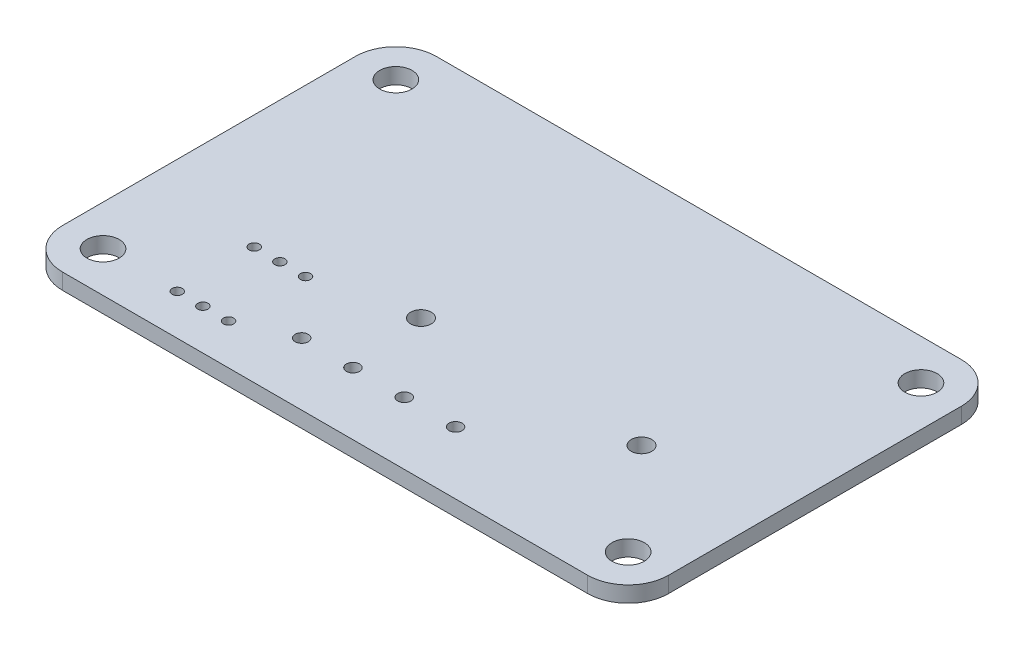
ISO-10303-21;
HEADER;
FILE_DESCRIPTION(('STEP AP214'),'2;1');
FILE_NAME('part.step','',(''),(''),'','','');
FILE_SCHEMA(('AUTOMOTIVE_DESIGN { 1 0 10303 214 1 1 1 1 }'));
ENDSEC;
DATA;
#1=APPLICATION_CONTEXT('core data for automotive mechanical design processes');
#2=APPLICATION_PROTOCOL_DEFINITION('international standard','automotive_design',2000,#1);
#3=PRODUCT_CONTEXT('',#1,'mechanical');
#4=PRODUCT('Part','Part','',(#3));
#5=PRODUCT_RELATED_PRODUCT_CATEGORY('part','',(#4));
#6=PRODUCT_DEFINITION_FORMATION('','',#4);
#7=PRODUCT_DEFINITION_CONTEXT('part definition',#1,'design');
#8=PRODUCT_DEFINITION('design','',#6,#7);
#9=PRODUCT_DEFINITION_SHAPE('','',#8);
#10=(LENGTH_UNIT() NAMED_UNIT(*) SI_UNIT(.MILLI.,.METRE.));
#11=(NAMED_UNIT(*) PLANE_ANGLE_UNIT() SI_UNIT($,.RADIAN.));
#12=(NAMED_UNIT(*) SI_UNIT($,.STERADIAN.) SOLID_ANGLE_UNIT());
#13=UNCERTAINTY_MEASURE_WITH_UNIT(LENGTH_MEASURE(1.E-05),#10,'distance_accuracy_value','');
#14=(GEOMETRIC_REPRESENTATION_CONTEXT(3) GLOBAL_UNCERTAINTY_ASSIGNED_CONTEXT((#13)) GLOBAL_UNIT_ASSIGNED_CONTEXT((#10,
#11,#12)) REPRESENTATION_CONTEXT('',''));
#15=CARTESIAN_POINT('',(0.,0.,0.));
#16=DIRECTION('',(0.,0.,1.));
#17=DIRECTION('',(1.,0.,0.));
#18=AXIS2_PLACEMENT_3D('',#15,#16,#17);
#19=CARTESIAN_POINT('',(30.,1.5748,18.5));
#20=DIRECTION('',(-1.,0.,0.));
#21=DIRECTION('',(0.,0.,1.));
#22=AXIS2_PLACEMENT_3D('',#19,#20,#21);
#23=PLANE('',#22);
#24=DIRECTION('',(0.,0.,-1.));
#25=VECTOR('',#24,1.);
#26=CARTESIAN_POINT('',(30.,1.5748,18.5));
#27=LINE('',#26,#25);
#28=CARTESIAN_POINT('',(30.,1.5748,14.5));
#29=VERTEX_POINT('',#28);
#30=CARTESIAN_POINT('',(30.,1.5748,-14.5));
#31=VERTEX_POINT('',#30);
#32=EDGE_CURVE('E119',#29,#31,#27,.T.);
#33=ORIENTED_EDGE('',*,*,#32,.F.);
#34=DIRECTION('',(0.,-1.,0.));
#35=VECTOR('',#34,1.);
#36=CARTESIAN_POINT('',(30.,1.5748,14.5));
#37=LINE('',#36,#35);
#38=CARTESIAN_POINT('',(30.,0.,14.5));
#39=VERTEX_POINT('',#38);
#40=EDGE_CURVE('E104',#29,#39,#37,.T.);
#41=ORIENTED_EDGE('',*,*,#40,.T.);
#42=DIRECTION('',(0.,0.,-1.));
#43=VECTOR('',#42,1.);
#44=CARTESIAN_POINT('',(30.,0.,18.5));
#45=LINE('',#44,#43);
#46=CARTESIAN_POINT('',(30.,0.,-14.5));
#47=VERTEX_POINT('',#46);
#48=EDGE_CURVE('E116',#39,#47,#45,.T.);
#49=ORIENTED_EDGE('',*,*,#48,.T.);
#50=DIRECTION('',(0.,-1.,0.));
#51=VECTOR('',#50,1.);
#52=CARTESIAN_POINT('',(30.,1.5748,-14.5));
#53=LINE('',#52,#51);
#54=EDGE_CURVE('E121',#47,#31,#53,.F.);
#55=ORIENTED_EDGE('',*,*,#54,.T.);
#56=EDGE_LOOP('',(#33,#41,#49,#55));
#57=FACE_BOUND('',#56,.T.);
#58=ADVANCED_FACE('F33',(#57),#23,.F.);
#59=CARTESIAN_POINT('',(-30.,1.5748,-18.5));
#60=DIRECTION('',(0.,0.,1.));
#61=DIRECTION('',(1.,0.,0.));
#62=AXIS2_PLACEMENT_3D('',#59,#60,#61);
#63=PLANE('',#62);
#64=DIRECTION('',(-1.,0.,0.));
#65=VECTOR('',#64,1.);
#66=CARTESIAN_POINT('',(-30.,1.5748,-18.5));
#67=LINE('',#66,#65);
#68=CARTESIAN_POINT('',(26.,1.5748,-18.5));
#69=VERTEX_POINT('',#68);
#70=CARTESIAN_POINT('',(-26.,1.5748,-18.5));
#71=VERTEX_POINT('',#70);
#72=EDGE_CURVE('E445',#69,#71,#67,.T.);
#73=ORIENTED_EDGE('',*,*,#72,.F.);
#74=DIRECTION('',(0.,-1.,0.));
#75=VECTOR('',#74,1.);
#76=CARTESIAN_POINT('',(26.,1.5748,-18.5));
#77=LINE('',#76,#75);
#78=CARTESIAN_POINT('',(26.,0.,-18.5));
#79=VERTEX_POINT('',#78);
#80=EDGE_CURVE('E159',#69,#79,#77,.T.);
#81=ORIENTED_EDGE('',*,*,#80,.T.);
#82=DIRECTION('',(-1.,0.,0.));
#83=VECTOR('',#82,1.);
#84=CARTESIAN_POINT('',(-30.,0.,-18.5));
#85=LINE('',#84,#83);
#86=CARTESIAN_POINT('',(-26.,0.,-18.5));
#87=VERTEX_POINT('',#86);
#88=EDGE_CURVE('E126',#79,#87,#85,.T.);
#89=ORIENTED_EDGE('',*,*,#88,.T.);
#90=DIRECTION('',(0.,-1.,0.));
#91=VECTOR('',#90,1.);
#92=CARTESIAN_POINT('',(-26.,1.5748,-18.5));
#93=LINE('',#92,#91);
#94=EDGE_CURVE('E157',#87,#71,#93,.F.);
#95=ORIENTED_EDGE('',*,*,#94,.T.);
#96=EDGE_LOOP('',(#73,#81,#89,#95));
#97=FACE_BOUND('',#96,.T.);
#98=ADVANCED_FACE('F223',(#97),#63,.F.);
#99=CARTESIAN_POINT('',(-30.,1.5748,18.5));
#100=DIRECTION('',(1.,0.,0.));
#101=DIRECTION('',(0.,0.,-1.));
#102=AXIS2_PLACEMENT_3D('',#99,#100,#101);
#103=PLANE('',#102);
#104=DIRECTION('',(0.,0.,1.));
#105=VECTOR('',#104,1.);
#106=CARTESIAN_POINT('',(-30.,1.5748,18.5));
#107=LINE('',#106,#105);
#108=CARTESIAN_POINT('',(-30.,1.5748,-14.5));
#109=VERTEX_POINT('',#108);
#110=CARTESIAN_POINT('',(-30.,1.5748,14.5));
#111=VERTEX_POINT('',#110);
#112=EDGE_CURVE('E441',#109,#111,#107,.T.);
#113=ORIENTED_EDGE('',*,*,#112,.F.);
#114=DIRECTION('',(0.,-1.,0.));
#115=VECTOR('',#114,1.);
#116=CARTESIAN_POINT('',(-30.,1.5748,-14.5));
#117=LINE('',#116,#115);
#118=CARTESIAN_POINT('',(-30.,0.,-14.5));
#119=VERTEX_POINT('',#118);
#120=EDGE_CURVE('E163',#109,#119,#117,.T.);
#121=ORIENTED_EDGE('',*,*,#120,.T.);
#122=DIRECTION('',(0.,0.,1.));
#123=VECTOR('',#122,1.);
#124=CARTESIAN_POINT('',(-30.,0.,18.5));
#125=LINE('',#124,#123);
#126=CARTESIAN_POINT('',(-30.,0.,14.5));
#127=VERTEX_POINT('',#126);
#128=EDGE_CURVE('E130',#119,#127,#125,.T.);
#129=ORIENTED_EDGE('',*,*,#128,.T.);
#130=DIRECTION('',(0.,-1.,0.));
#131=VECTOR('',#130,1.);
#132=CARTESIAN_POINT('',(-30.,1.5748,14.5));
#133=LINE('',#132,#131);
#134=EDGE_CURVE('E48',#127,#111,#133,.F.);
#135=ORIENTED_EDGE('',*,*,#134,.T.);
#136=EDGE_LOOP('',(#113,#121,#129,#135));
#137=FACE_BOUND('',#136,.T.);
#138=ADVANCED_FACE('F216',(#137),#103,.F.);
#139=CARTESIAN_POINT('',(-30.,1.5748,18.5));
#140=DIRECTION('',(0.,0.,-1.));
#141=DIRECTION('',(-1.,0.,0.));
#142=AXIS2_PLACEMENT_3D('',#139,#140,#141);
#143=PLANE('',#142);
#144=DIRECTION('',(1.,0.,0.));
#145=VECTOR('',#144,1.);
#146=CARTESIAN_POINT('',(-30.,0.,18.5));
#147=LINE('',#146,#145);
#148=CARTESIAN_POINT('',(-26.,0.,18.5));
#149=VERTEX_POINT('',#148);
#150=CARTESIAN_POINT('',(26.,0.,18.5));
#151=VERTEX_POINT('',#150);
#152=EDGE_CURVE('E140',#149,#151,#147,.T.);
#153=ORIENTED_EDGE('',*,*,#152,.T.);
#154=DIRECTION('',(0.,-1.,0.));
#155=VECTOR('',#154,1.);
#156=CARTESIAN_POINT('',(26.,1.5748,18.5));
#157=LINE('',#156,#155);
#158=CARTESIAN_POINT('',(26.,1.5748,18.5));
#159=VERTEX_POINT('',#158);
#160=EDGE_CURVE('E105',#151,#159,#157,.F.);
#161=ORIENTED_EDGE('',*,*,#160,.T.);
#162=DIRECTION('',(1.,0.,0.));
#163=VECTOR('',#162,1.);
#164=CARTESIAN_POINT('',(-30.,1.5748,18.5));
#165=LINE('',#164,#163);
#166=CARTESIAN_POINT('',(-26.,1.5748,18.5));
#167=VERTEX_POINT('',#166);
#168=EDGE_CURVE('E136',#167,#159,#165,.T.);
#169=ORIENTED_EDGE('',*,*,#168,.F.);
#170=DIRECTION('',(0.,-1.,0.));
#171=VECTOR('',#170,1.);
#172=CARTESIAN_POINT('',(-26.,1.5748,18.5));
#173=LINE('',#172,#171);
#174=EDGE_CURVE('E110',#167,#149,#173,.T.);
#175=ORIENTED_EDGE('',*,*,#174,.T.);
#176=EDGE_LOOP('',(#153,#161,#169,#175));
#177=FACE_BOUND('',#176,.T.);
#178=ADVANCED_FACE('F206',(#177),#143,.F.);
#179=CARTESIAN_POINT('',(30.,1.5748,-18.5));
#180=DIRECTION('',(0.,-1.,0.));
#181=DIRECTION('',(0.,0.,-1.));
#182=AXIS2_PLACEMENT_3D('',#179,#180,#181);
#183=PLANE('',#182);
#184=CARTESIAN_POINT('',(-16.129,1.5748,14.478));
#185=DIRECTION('',(0.,1.,0.));
#186=DIRECTION('',(0.,0.,1.));
#187=AXIS2_PLACEMENT_3D('',#184,#185,#186);
#188=CIRCLE('',#187,0.508);
#189=CARTESIAN_POINT('',(-16.129,1.5748,14.986));
#190=VERTEX_POINT('',#189);
#191=EDGE_CURVE('E503',#190,#190,#188,.T.);
#192=ORIENTED_EDGE('',*,*,#191,.F.);
#193=EDGE_LOOP('',(#192));
#194=FACE_BOUND('',#193,.T.);
#195=CARTESIAN_POINT('',(-13.589,1.5748,14.478));
#196=DIRECTION('',(0.,1.,0.));
#197=DIRECTION('',(0.,0.,1.));
#198=AXIS2_PLACEMENT_3D('',#195,#196,#197);
#199=CIRCLE('',#198,0.508);
#200=CARTESIAN_POINT('',(-13.589,1.5748,14.986));
#201=VERTEX_POINT('',#200);
#202=EDGE_CURVE('E500',#201,#201,#199,.T.);
#203=ORIENTED_EDGE('',*,*,#202,.F.);
#204=EDGE_LOOP('',(#203));
#205=FACE_BOUND('',#204,.T.);
#206=CARTESIAN_POINT('',(1.651,1.5748,12.319));
#207=DIRECTION('',(0.,1.,0.));
#208=DIRECTION('',(0.,0.,1.));
#209=AXIS2_PLACEMENT_3D('',#206,#207,#208);
#210=CIRCLE('',#209,0.6477);
#211=CARTESIAN_POINT('',(1.651,1.5748,12.9667));
#212=VERTEX_POINT('',#211);
#213=EDGE_CURVE('E491',#212,#212,#210,.T.);
#214=ORIENTED_EDGE('',*,*,#213,.F.);
#215=EDGE_LOOP('',(#214));
#216=FACE_BOUND('',#215,.T.);
#217=CARTESIAN_POINT('',(6.731,1.5748,12.319));
#218=DIRECTION('',(0.,1.,0.));
#219=DIRECTION('',(0.,0.,1.));
#220=AXIS2_PLACEMENT_3D('',#217,#218,#219);
#221=CIRCLE('',#220,0.6477);
#222=CARTESIAN_POINT('',(6.731,1.5748,12.9667));
#223=VERTEX_POINT('',#222);
#224=EDGE_CURVE('E488',#223,#223,#221,.T.);
#225=ORIENTED_EDGE('',*,*,#224,.F.);
#226=EDGE_LOOP('',(#225));
#227=FACE_BOUND('',#226,.T.);
#228=CARTESIAN_POINT('',(17.526,1.5748,4.699));
#229=DIRECTION('',(0.,1.,0.));
#230=DIRECTION('',(0.,0.,1.));
#231=AXIS2_PLACEMENT_3D('',#228,#229,#230);
#232=CIRCLE('',#231,1.016);
#233=CARTESIAN_POINT('',(17.526,1.5748,5.715));
#234=VERTEX_POINT('',#233);
#235=EDGE_CURVE('E482',#234,#234,#232,.T.);
#236=ORIENTED_EDGE('',*,*,#235,.F.);
#237=EDGE_LOOP('',(#236));
#238=FACE_BOUND('',#237,.T.);
#239=CARTESIAN_POINT('',(-4.318,1.5748,4.699));
#240=DIRECTION('',(0.,1.,0.));
#241=DIRECTION('',(0.,0.,1.));
#242=AXIS2_PLACEMENT_3D('',#239,#240,#241);
#243=CIRCLE('',#242,1.016);
#244=CARTESIAN_POINT('',(-4.318,1.5748,5.715));
#245=VERTEX_POINT('',#244);
#246=EDGE_CURVE('E476',#245,#245,#243,.T.);
#247=ORIENTED_EDGE('',*,*,#246,.F.);
#248=EDGE_LOOP('',(#247));
#249=FACE_BOUND('',#248,.T.);
#250=CARTESIAN_POINT('',(26.,1.5748,-14.5));
#251=DIRECTION('',(0.,1.,0.));
#252=DIRECTION('',(0.,0.,1.));
#253=AXIS2_PLACEMENT_3D('',#250,#251,#252);
#254=CIRCLE('',#253,1.6);
#255=CARTESIAN_POINT('',(26.,1.5748,-12.9));
#256=VERTEX_POINT('',#255);
#257=EDGE_CURVE('E470',#256,#256,#254,.T.);
#258=ORIENTED_EDGE('',*,*,#257,.F.);
#259=EDGE_LOOP('',(#258));
#260=FACE_BOUND('',#259,.T.);
#261=CARTESIAN_POINT('',(26.,1.5748,14.5));
#262=DIRECTION('',(0.,1.,0.));
#263=DIRECTION('',(0.,0.,1.));
#264=AXIS2_PLACEMENT_3D('',#261,#262,#263);
#265=CIRCLE('',#264,1.6);
#266=CARTESIAN_POINT('',(26.,1.5748,16.1));
#267=VERTEX_POINT('',#266);
#268=EDGE_CURVE('E464',#267,#267,#265,.T.);
#269=ORIENTED_EDGE('',*,*,#268,.F.);
#270=EDGE_LOOP('',(#269));
#271=FACE_BOUND('',#270,.T.);
#272=CARTESIAN_POINT('',(-26.,1.5748,14.5));
#273=DIRECTION('',(0.,1.,0.));
#274=DIRECTION('',(0.,0.,1.));
#275=AXIS2_PLACEMENT_3D('',#272,#273,#274);
#276=CIRCLE('',#275,1.6);
#277=CARTESIAN_POINT('',(-26.,1.5748,16.1));
#278=VERTEX_POINT('',#277);
#279=EDGE_CURVE('E458',#278,#278,#276,.T.);
#280=ORIENTED_EDGE('',*,*,#279,.F.);
#281=EDGE_LOOP('',(#280));
#282=FACE_BOUND('',#281,.T.);
#283=CARTESIAN_POINT('',(-26.,1.5748,-14.5));
#284=DIRECTION('',(0.,1.,0.));
#285=DIRECTION('',(0.,0.,1.));
#286=AXIS2_PLACEMENT_3D('',#283,#284,#285);
#287=CIRCLE('',#286,1.6);
#288=CARTESIAN_POINT('',(-26.,1.5748,-12.9));
#289=VERTEX_POINT('',#288);
#290=EDGE_CURVE('E133',#289,#289,#287,.T.);
#291=ORIENTED_EDGE('',*,*,#290,.F.);
#292=EDGE_LOOP('',(#291));
#293=FACE_BOUND('',#292,.T.);
#294=ORIENTED_EDGE('',*,*,#168,.T.);
#295=CARTESIAN_POINT('',(26.,1.5748,14.5));
#296=DIRECTION('',(0.,-1.,0.));
#297=DIRECTION('',(0.,0.,-1.));
#298=AXIS2_PLACEMENT_3D('',#295,#296,#297);
#299=CIRCLE('',#298,4.);
#300=EDGE_CURVE('E155',#159,#29,#299,.F.);
#301=ORIENTED_EDGE('',*,*,#300,.T.);
#302=ORIENTED_EDGE('',*,*,#32,.T.);
#303=CARTESIAN_POINT('',(26.,1.5748,-14.5));
#304=DIRECTION('',(0.,-1.,0.));
#305=DIRECTION('',(0.,0.,-1.));
#306=AXIS2_PLACEMENT_3D('',#303,#304,#305);
#307=CIRCLE('',#306,4.);
#308=EDGE_CURVE('E153',#31,#69,#307,.F.);
#309=ORIENTED_EDGE('',*,*,#308,.T.);
#310=ORIENTED_EDGE('',*,*,#72,.T.);
#311=CARTESIAN_POINT('',(-26.,1.5748,-14.5));
#312=DIRECTION('',(0.,-1.,0.));
#313=DIRECTION('',(0.,0.,-1.));
#314=AXIS2_PLACEMENT_3D('',#311,#312,#313);
#315=CIRCLE('',#314,4.);
#316=EDGE_CURVE('E55',#71,#109,#315,.F.);
#317=ORIENTED_EDGE('',*,*,#316,.T.);
#318=ORIENTED_EDGE('',*,*,#112,.T.);
#319=CARTESIAN_POINT('',(-26.,1.5748,14.5));
#320=DIRECTION('',(0.,-1.,0.));
#321=DIRECTION('',(0.,0.,-1.));
#322=AXIS2_PLACEMENT_3D('',#319,#320,#321);
#323=CIRCLE('',#322,4.);
#324=EDGE_CURVE('E150',#111,#167,#323,.F.);
#325=ORIENTED_EDGE('',*,*,#324,.T.);
#326=EDGE_LOOP('',(#294,#301,#302,#309,#310,#317,#318,#325));
#327=FACE_BOUND('',#326,.T.);
#328=CARTESIAN_POINT('',(-3.429,1.5748,12.319));
#329=DIRECTION('',(0.,1.,0.));
#330=DIRECTION('',(0.,0.,1.));
#331=AXIS2_PLACEMENT_3D('',#328,#329,#330);
#332=CIRCLE('',#331,0.6477);
#333=CARTESIAN_POINT('',(-3.429,1.5748,12.9667));
#334=VERTEX_POINT('',#333);
#335=EDGE_CURVE('E169',#334,#334,#332,.T.);
#336=ORIENTED_EDGE('',*,*,#335,.F.);
#337=EDGE_LOOP('',(#336));
#338=FACE_BOUND('',#337,.T.);
#339=CARTESIAN_POINT('',(-8.509,1.5748,12.319));
#340=DIRECTION('',(0.,1.,0.));
#341=DIRECTION('',(0.,0.,1.));
#342=AXIS2_PLACEMENT_3D('',#339,#340,#341);
#343=CIRCLE('',#342,0.6477);
#344=CARTESIAN_POINT('',(-8.509,1.5748,12.9667));
#345=VERTEX_POINT('',#344);
#346=EDGE_CURVE('E175',#345,#345,#343,.T.);
#347=ORIENTED_EDGE('',*,*,#346,.F.);
#348=EDGE_LOOP('',(#347));
#349=FACE_BOUND('',#348,.T.);
#350=CARTESIAN_POINT('',(-18.669,1.5748,14.478));
#351=DIRECTION('',(0.,1.,0.));
#352=DIRECTION('',(0.,0.,1.));
#353=AXIS2_PLACEMENT_3D('',#350,#351,#352);
#354=CIRCLE('',#353,0.508);
#355=CARTESIAN_POINT('',(-18.669,1.5748,14.986));
#356=VERTEX_POINT('',#355);
#357=EDGE_CURVE('E181',#356,#356,#354,.T.);
#358=ORIENTED_EDGE('',*,*,#357,.F.);
#359=EDGE_LOOP('',(#358));
#360=FACE_BOUND('',#359,.T.);
#361=CARTESIAN_POINT('',(-13.589,1.5748,6.858));
#362=DIRECTION('',(0.,1.,0.));
#363=DIRECTION('',(0.,0.,1.));
#364=AXIS2_PLACEMENT_3D('',#361,#362,#363);
#365=CIRCLE('',#364,0.508);
#366=CARTESIAN_POINT('',(-13.589,1.5748,7.366));
#367=VERTEX_POINT('',#366);
#368=EDGE_CURVE('E187',#367,#367,#365,.T.);
#369=ORIENTED_EDGE('',*,*,#368,.F.);
#370=EDGE_LOOP('',(#369));
#371=FACE_BOUND('',#370,.T.);
#372=CARTESIAN_POINT('',(-16.129,1.5748,6.858));
#373=DIRECTION('',(0.,1.,0.));
#374=DIRECTION('',(0.,0.,1.));
#375=AXIS2_PLACEMENT_3D('',#372,#373,#374);
#376=CIRCLE('',#375,0.508);
#377=CARTESIAN_POINT('',(-16.129,1.5748,7.366));
#378=VERTEX_POINT('',#377);
#379=EDGE_CURVE('E193',#378,#378,#376,.T.);
#380=ORIENTED_EDGE('',*,*,#379,.F.);
#381=EDGE_LOOP('',(#380));
#382=FACE_BOUND('',#381,.T.);
#383=CARTESIAN_POINT('',(-18.669,1.5748,6.858));
#384=DIRECTION('',(0.,1.,0.));
#385=DIRECTION('',(0.,0.,1.));
#386=AXIS2_PLACEMENT_3D('',#383,#384,#385);
#387=CIRCLE('',#386,0.508);
#388=CARTESIAN_POINT('',(-18.669,1.5748,7.366));
#389=VERTEX_POINT('',#388);
#390=EDGE_CURVE('E11',#389,#389,#387,.T.);
#391=ORIENTED_EDGE('',*,*,#390,.F.);
#392=EDGE_LOOP('',(#391));
#393=FACE_BOUND('',#392,.T.);
#394=ADVANCED_FACE('F204',(#194,#205,#216,#227,#238,#249,#260,#271,#282,#293,#327,#338,#349,
#360,#371,#382,#393),#183,.F.);
#395=CARTESIAN_POINT('',(30.,0.,-18.5));
#396=DIRECTION('',(0.,-1.,0.));
#397=DIRECTION('',(0.,0.,-1.));
#398=AXIS2_PLACEMENT_3D('',#395,#396,#397);
#399=PLANE('',#398);
#400=CARTESIAN_POINT('',(-16.129,0.,14.478));
#401=DIRECTION('',(0.,1.,0.));
#402=DIRECTION('',(0.,0.,1.));
#403=AXIS2_PLACEMENT_3D('',#400,#401,#402);
#404=CIRCLE('',#403,0.508);
#405=CARTESIAN_POINT('',(-16.129,0.,14.986));
#406=VERTEX_POINT('',#405);
#407=EDGE_CURVE('E508',#406,#406,#404,.T.);
#408=ORIENTED_EDGE('',*,*,#407,.T.);
#409=EDGE_LOOP('',(#408));
#410=FACE_BOUND('',#409,.T.);
#411=CARTESIAN_POINT('',(-13.589,0.,14.478));
#412=DIRECTION('',(0.,1.,0.));
#413=DIRECTION('',(0.,0.,1.));
#414=AXIS2_PLACEMENT_3D('',#411,#412,#413);
#415=CIRCLE('',#414,0.508);
#416=CARTESIAN_POINT('',(-13.589,0.,14.986));
#417=VERTEX_POINT('',#416);
#418=EDGE_CURVE('E499',#417,#417,#415,.T.);
#419=ORIENTED_EDGE('',*,*,#418,.T.);
#420=EDGE_LOOP('',(#419));
#421=FACE_BOUND('',#420,.T.);
#422=CARTESIAN_POINT('',(1.651,0.,12.319));
#423=DIRECTION('',(0.,1.,0.));
#424=DIRECTION('',(0.,0.,1.));
#425=AXIS2_PLACEMENT_3D('',#422,#423,#424);
#426=CIRCLE('',#425,0.6477);
#427=CARTESIAN_POINT('',(1.651,0.,12.9667));
#428=VERTEX_POINT('',#427);
#429=EDGE_CURVE('E496',#428,#428,#426,.T.);
#430=ORIENTED_EDGE('',*,*,#429,.T.);
#431=EDGE_LOOP('',(#430));
#432=FACE_BOUND('',#431,.T.);
#433=CARTESIAN_POINT('',(6.731,0.,12.319));
#434=DIRECTION('',(0.,1.,0.));
#435=DIRECTION('',(0.,0.,1.));
#436=AXIS2_PLACEMENT_3D('',#433,#434,#435);
#437=CIRCLE('',#436,0.6477);
#438=CARTESIAN_POINT('',(6.731,0.,12.9667));
#439=VERTEX_POINT('',#438);
#440=EDGE_CURVE('E485',#439,#439,#437,.T.);
#441=ORIENTED_EDGE('',*,*,#440,.T.);
#442=EDGE_LOOP('',(#441));
#443=FACE_BOUND('',#442,.T.);
#444=CARTESIAN_POINT('',(17.526,0.,4.699));
#445=DIRECTION('',(0.,1.,0.));
#446=DIRECTION('',(0.,0.,1.));
#447=AXIS2_PLACEMENT_3D('',#444,#445,#446);
#448=CIRCLE('',#447,1.016);
#449=CARTESIAN_POINT('',(17.526,0.,5.715));
#450=VERTEX_POINT('',#449);
#451=EDGE_CURVE('E479',#450,#450,#448,.T.);
#452=ORIENTED_EDGE('',*,*,#451,.T.);
#453=EDGE_LOOP('',(#452));
#454=FACE_BOUND('',#453,.T.);
#455=CARTESIAN_POINT('',(-4.318,0.,4.699));
#456=DIRECTION('',(0.,1.,0.));
#457=DIRECTION('',(0.,0.,1.));
#458=AXIS2_PLACEMENT_3D('',#455,#456,#457);
#459=CIRCLE('',#458,1.016);
#460=CARTESIAN_POINT('',(-4.318,0.,5.715));
#461=VERTEX_POINT('',#460);
#462=EDGE_CURVE('E473',#461,#461,#459,.T.);
#463=ORIENTED_EDGE('',*,*,#462,.T.);
#464=EDGE_LOOP('',(#463));
#465=FACE_BOUND('',#464,.T.);
#466=CARTESIAN_POINT('',(26.,0.,-14.5));
#467=DIRECTION('',(0.,1.,0.));
#468=DIRECTION('',(0.,0.,1.));
#469=AXIS2_PLACEMENT_3D('',#466,#467,#468);
#470=CIRCLE('',#469,1.6);
#471=CARTESIAN_POINT('',(26.,0.,-12.9));
#472=VERTEX_POINT('',#471);
#473=EDGE_CURVE('E467',#472,#472,#470,.T.);
#474=ORIENTED_EDGE('',*,*,#473,.T.);
#475=EDGE_LOOP('',(#474));
#476=FACE_BOUND('',#475,.T.);
#477=CARTESIAN_POINT('',(26.,0.,14.5));
#478=DIRECTION('',(0.,1.,0.));
#479=DIRECTION('',(0.,0.,1.));
#480=AXIS2_PLACEMENT_3D('',#477,#478,#479);
#481=CIRCLE('',#480,1.6);
#482=CARTESIAN_POINT('',(26.,0.,16.1));
#483=VERTEX_POINT('',#482);
#484=EDGE_CURVE('E461',#483,#483,#481,.T.);
#485=ORIENTED_EDGE('',*,*,#484,.T.);
#486=EDGE_LOOP('',(#485));
#487=FACE_BOUND('',#486,.T.);
#488=CARTESIAN_POINT('',(-26.,0.,14.5));
#489=DIRECTION('',(0.,1.,0.));
#490=DIRECTION('',(0.,0.,1.));
#491=AXIS2_PLACEMENT_3D('',#488,#489,#490);
#492=CIRCLE('',#491,1.6);
#493=CARTESIAN_POINT('',(-26.,0.,16.1));
#494=VERTEX_POINT('',#493);
#495=EDGE_CURVE('E456',#494,#494,#492,.T.);
#496=ORIENTED_EDGE('',*,*,#495,.T.);
#497=EDGE_LOOP('',(#496));
#498=FACE_BOUND('',#497,.T.);
#499=CARTESIAN_POINT('',(-26.,0.,-14.5));
#500=DIRECTION('',(0.,1.,0.));
#501=DIRECTION('',(0.,0.,1.));
#502=AXIS2_PLACEMENT_3D('',#499,#500,#501);
#503=CIRCLE('',#502,1.6);
#504=CARTESIAN_POINT('',(-26.,0.,-12.9));
#505=VERTEX_POINT('',#504);
#506=EDGE_CURVE('E127',#505,#505,#503,.T.);
#507=ORIENTED_EDGE('',*,*,#506,.T.);
#508=EDGE_LOOP('',(#507));
#509=FACE_BOUND('',#508,.T.);
#510=ORIENTED_EDGE('',*,*,#48,.F.);
#511=CARTESIAN_POINT('',(26.,0.,14.5));
#512=DIRECTION('',(0.,-1.,0.));
#513=DIRECTION('',(0.,0.,-1.));
#514=AXIS2_PLACEMENT_3D('',#511,#512,#513);
#515=CIRCLE('',#514,4.);
#516=EDGE_CURVE('E100',#39,#151,#515,.T.);
#517=ORIENTED_EDGE('',*,*,#516,.T.);
#518=ORIENTED_EDGE('',*,*,#152,.F.);
#519=CARTESIAN_POINT('',(-26.,0.,14.5));
#520=DIRECTION('',(0.,-1.,0.));
#521=DIRECTION('',(0.,0.,-1.));
#522=AXIS2_PLACEMENT_3D('',#519,#520,#521);
#523=CIRCLE('',#522,4.);
#524=EDGE_CURVE('E120',#149,#127,#523,.T.);
#525=ORIENTED_EDGE('',*,*,#524,.T.);
#526=ORIENTED_EDGE('',*,*,#128,.F.);
#527=CARTESIAN_POINT('',(-26.,0.,-14.5));
#528=DIRECTION('',(0.,-1.,0.));
#529=DIRECTION('',(0.,0.,-1.));
#530=AXIS2_PLACEMENT_3D('',#527,#528,#529);
#531=CIRCLE('',#530,4.);
#532=EDGE_CURVE('E144',#119,#87,#531,.T.);
#533=ORIENTED_EDGE('',*,*,#532,.T.);
#534=ORIENTED_EDGE('',*,*,#88,.F.);
#535=CARTESIAN_POINT('',(26.,0.,-14.5));
#536=DIRECTION('',(0.,-1.,0.));
#537=DIRECTION('',(0.,0.,-1.));
#538=AXIS2_PLACEMENT_3D('',#535,#536,#537);
#539=CIRCLE('',#538,4.);
#540=EDGE_CURVE('E111',#79,#47,#539,.T.);
#541=ORIENTED_EDGE('',*,*,#540,.T.);
#542=EDGE_LOOP('',(#510,#517,#518,#525,#526,#533,#534,#541));
#543=FACE_BOUND('',#542,.T.);
#544=CARTESIAN_POINT('',(-3.429,0.,12.319));
#545=DIRECTION('',(0.,1.,0.));
#546=DIRECTION('',(0.,0.,1.));
#547=AXIS2_PLACEMENT_3D('',#544,#545,#546);
#548=CIRCLE('',#547,0.6477);
#549=CARTESIAN_POINT('',(-3.429,0.,12.9667));
#550=VERTEX_POINT('',#549);
#551=EDGE_CURVE('E166',#550,#550,#548,.T.);
#552=ORIENTED_EDGE('',*,*,#551,.T.);
#553=EDGE_LOOP('',(#552));
#554=FACE_BOUND('',#553,.T.);
#555=CARTESIAN_POINT('',(-8.509,0.,12.319));
#556=DIRECTION('',(0.,1.,0.));
#557=DIRECTION('',(0.,0.,1.));
#558=AXIS2_PLACEMENT_3D('',#555,#556,#557);
#559=CIRCLE('',#558,0.6477);
#560=CARTESIAN_POINT('',(-8.509,0.,12.9667));
#561=VERTEX_POINT('',#560);
#562=EDGE_CURVE('E172',#561,#561,#559,.T.);
#563=ORIENTED_EDGE('',*,*,#562,.T.);
#564=EDGE_LOOP('',(#563));
#565=FACE_BOUND('',#564,.T.);
#566=CARTESIAN_POINT('',(-18.669,0.,14.478));
#567=DIRECTION('',(0.,1.,0.));
#568=DIRECTION('',(0.,0.,1.));
#569=AXIS2_PLACEMENT_3D('',#566,#567,#568);
#570=CIRCLE('',#569,0.508);
#571=CARTESIAN_POINT('',(-18.669,0.,14.986));
#572=VERTEX_POINT('',#571);
#573=EDGE_CURVE('E178',#572,#572,#570,.T.);
#574=ORIENTED_EDGE('',*,*,#573,.T.);
#575=EDGE_LOOP('',(#574));
#576=FACE_BOUND('',#575,.T.);
#577=CARTESIAN_POINT('',(-13.589,0.,6.858));
#578=DIRECTION('',(0.,1.,0.));
#579=DIRECTION('',(0.,0.,1.));
#580=AXIS2_PLACEMENT_3D('',#577,#578,#579);
#581=CIRCLE('',#580,0.508);
#582=CARTESIAN_POINT('',(-13.589,0.,7.366));
#583=VERTEX_POINT('',#582);
#584=EDGE_CURVE('E184',#583,#583,#581,.T.);
#585=ORIENTED_EDGE('',*,*,#584,.T.);
#586=EDGE_LOOP('',(#585));
#587=FACE_BOUND('',#586,.T.);
#588=CARTESIAN_POINT('',(-16.129,0.,6.858));
#589=DIRECTION('',(0.,1.,0.));
#590=DIRECTION('',(0.,0.,1.));
#591=AXIS2_PLACEMENT_3D('',#588,#589,#590);
#592=CIRCLE('',#591,0.508);
#593=CARTESIAN_POINT('',(-16.129,0.,7.366));
#594=VERTEX_POINT('',#593);
#595=EDGE_CURVE('E190',#594,#594,#592,.T.);
#596=ORIENTED_EDGE('',*,*,#595,.T.);
#597=EDGE_LOOP('',(#596));
#598=FACE_BOUND('',#597,.T.);
#599=CARTESIAN_POINT('',(-18.669,0.,6.858));
#600=DIRECTION('',(0.,1.,0.));
#601=DIRECTION('',(0.,0.,1.));
#602=AXIS2_PLACEMENT_3D('',#599,#600,#601);
#603=CIRCLE('',#602,0.508);
#604=CARTESIAN_POINT('',(-18.669,0.,7.366));
#605=VERTEX_POINT('',#604);
#606=EDGE_CURVE('E41',#605,#605,#603,.T.);
#607=ORIENTED_EDGE('',*,*,#606,.T.);
#608=EDGE_LOOP('',(#607));
#609=FACE_BOUND('',#608,.T.);
#610=ADVANCED_FACE('F123',(#410,#421,#432,#443,#454,#465,#476,#487,#498,#509,#543,#554,#565,
#576,#587,#598,#609),#399,.T.);
#611=CARTESIAN_POINT('',(26.,1.5748,14.5));
#612=DIRECTION('',(0.,-1.,0.));
#613=DIRECTION('',(0.,0.,-1.));
#614=AXIS2_PLACEMENT_3D('',#611,#612,#613);
#615=CYLINDRICAL_SURFACE('',#614,4.);
#616=ORIENTED_EDGE('',*,*,#300,.F.);
#617=ORIENTED_EDGE('',*,*,#160,.F.);
#618=ORIENTED_EDGE('',*,*,#516,.F.);
#619=ORIENTED_EDGE('',*,*,#40,.F.);
#620=EDGE_LOOP('',(#616,#617,#618,#619));
#621=FACE_BOUND('',#620,.T.);
#622=ADVANCED_FACE('F103',(#621),#615,.T.);
#623=CARTESIAN_POINT('',(26.,1.5748,-14.5));
#624=DIRECTION('',(0.,-1.,0.));
#625=DIRECTION('',(0.,0.,-1.));
#626=AXIS2_PLACEMENT_3D('',#623,#624,#625);
#627=CYLINDRICAL_SURFACE('',#626,4.);
#628=ORIENTED_EDGE('',*,*,#308,.F.);
#629=ORIENTED_EDGE('',*,*,#54,.F.);
#630=ORIENTED_EDGE('',*,*,#540,.F.);
#631=ORIENTED_EDGE('',*,*,#80,.F.);
#632=EDGE_LOOP('',(#628,#629,#630,#631));
#633=FACE_BOUND('',#632,.T.);
#634=ADVANCED_FACE('F234',(#633),#627,.T.);
#635=CARTESIAN_POINT('',(-26.,1.5748,-14.5));
#636=DIRECTION('',(0.,-1.,0.));
#637=DIRECTION('',(0.,0.,-1.));
#638=AXIS2_PLACEMENT_3D('',#635,#636,#637);
#639=CYLINDRICAL_SURFACE('',#638,4.);
#640=ORIENTED_EDGE('',*,*,#316,.F.);
#641=ORIENTED_EDGE('',*,*,#94,.F.);
#642=ORIENTED_EDGE('',*,*,#532,.F.);
#643=ORIENTED_EDGE('',*,*,#120,.F.);
#644=EDGE_LOOP('',(#640,#641,#642,#643));
#645=FACE_BOUND('',#644,.T.);
#646=ADVANCED_FACE('F237',(#645),#639,.T.);
#647=CARTESIAN_POINT('',(-26.,1.5748,14.5));
#648=DIRECTION('',(0.,-1.,0.));
#649=DIRECTION('',(0.,0.,-1.));
#650=AXIS2_PLACEMENT_3D('',#647,#648,#649);
#651=CYLINDRICAL_SURFACE('',#650,4.);
#652=ORIENTED_EDGE('',*,*,#324,.F.);
#653=ORIENTED_EDGE('',*,*,#134,.F.);
#654=ORIENTED_EDGE('',*,*,#524,.F.);
#655=ORIENTED_EDGE('',*,*,#174,.F.);
#656=EDGE_LOOP('',(#652,#653,#654,#655));
#657=FACE_BOUND('',#656,.T.);
#658=ADVANCED_FACE('F241',(#657),#651,.T.);
#659=CARTESIAN_POINT('',(-26.,0.,-14.5));
#660=DIRECTION('',(0.,1.,0.));
#661=DIRECTION('',(0.,0.,1.));
#662=AXIS2_PLACEMENT_3D('',#659,#660,#661);
#663=CYLINDRICAL_SURFACE('',#662,1.6);
#664=ORIENTED_EDGE('',*,*,#506,.F.);
#665=EDGE_LOOP('',(#664));
#666=FACE_BOUND('',#665,.T.);
#667=ORIENTED_EDGE('',*,*,#290,.T.);
#668=EDGE_LOOP('',(#667));
#669=FACE_BOUND('',#668,.T.);
#670=ADVANCED_FACE('F245',(#666,#669),#663,.F.);
#671=CARTESIAN_POINT('',(-26.,0.,14.5));
#672=DIRECTION('',(0.,1.,0.));
#673=DIRECTION('',(0.,0.,1.));
#674=AXIS2_PLACEMENT_3D('',#671,#672,#673);
#675=CYLINDRICAL_SURFACE('',#674,1.6);
#676=ORIENTED_EDGE('',*,*,#495,.F.);
#677=EDGE_LOOP('',(#676));
#678=FACE_BOUND('',#677,.T.);
#679=ORIENTED_EDGE('',*,*,#279,.T.);
#680=EDGE_LOOP('',(#679));
#681=FACE_BOUND('',#680,.T.);
#682=ADVANCED_FACE('F371',(#678,#681),#675,.F.);
#683=CARTESIAN_POINT('',(26.,0.,14.5));
#684=DIRECTION('',(0.,1.,0.));
#685=DIRECTION('',(0.,0.,1.));
#686=AXIS2_PLACEMENT_3D('',#683,#684,#685);
#687=CYLINDRICAL_SURFACE('',#686,1.6);
#688=ORIENTED_EDGE('',*,*,#484,.F.);
#689=EDGE_LOOP('',(#688));
#690=FACE_BOUND('',#689,.T.);
#691=ORIENTED_EDGE('',*,*,#268,.T.);
#692=EDGE_LOOP('',(#691));
#693=FACE_BOUND('',#692,.T.);
#694=ADVANCED_FACE('F362',(#690,#693),#687,.F.);
#695=CARTESIAN_POINT('',(26.,0.,-14.5));
#696=DIRECTION('',(0.,1.,0.));
#697=DIRECTION('',(0.,0.,1.));
#698=AXIS2_PLACEMENT_3D('',#695,#696,#697);
#699=CYLINDRICAL_SURFACE('',#698,1.6);
#700=ORIENTED_EDGE('',*,*,#473,.F.);
#701=EDGE_LOOP('',(#700));
#702=FACE_BOUND('',#701,.T.);
#703=ORIENTED_EDGE('',*,*,#257,.T.);
#704=EDGE_LOOP('',(#703));
#705=FACE_BOUND('',#704,.T.);
#706=ADVANCED_FACE('F353',(#702,#705),#699,.F.);
#707=CARTESIAN_POINT('',(-4.318,0.,4.699));
#708=DIRECTION('',(0.,1.,0.));
#709=DIRECTION('',(0.,0.,1.));
#710=AXIS2_PLACEMENT_3D('',#707,#708,#709);
#711=CYLINDRICAL_SURFACE('',#710,1.016);
#712=ORIENTED_EDGE('',*,*,#462,.F.);
#713=EDGE_LOOP('',(#712));
#714=FACE_BOUND('',#713,.T.);
#715=ORIENTED_EDGE('',*,*,#246,.T.);
#716=EDGE_LOOP('',(#715));
#717=FACE_BOUND('',#716,.T.);
#718=ADVANCED_FACE('F344',(#714,#717),#711,.F.);
#719=CARTESIAN_POINT('',(17.526,0.,4.699));
#720=DIRECTION('',(0.,1.,0.));
#721=DIRECTION('',(0.,0.,1.));
#722=AXIS2_PLACEMENT_3D('',#719,#720,#721);
#723=CYLINDRICAL_SURFACE('',#722,1.016);
#724=ORIENTED_EDGE('',*,*,#451,.F.);
#725=EDGE_LOOP('',(#724));
#726=FACE_BOUND('',#725,.T.);
#727=ORIENTED_EDGE('',*,*,#235,.T.);
#728=EDGE_LOOP('',(#727));
#729=FACE_BOUND('',#728,.T.);
#730=ADVANCED_FACE('F335',(#726,#729),#723,.F.);
#731=CARTESIAN_POINT('',(6.731,0.,12.319));
#732=DIRECTION('',(0.,1.,0.));
#733=DIRECTION('',(0.,0.,1.));
#734=AXIS2_PLACEMENT_3D('',#731,#732,#733);
#735=CYLINDRICAL_SURFACE('',#734,0.6477);
#736=ORIENTED_EDGE('',*,*,#440,.F.);
#737=EDGE_LOOP('',(#736));
#738=FACE_BOUND('',#737,.T.);
#739=ORIENTED_EDGE('',*,*,#224,.T.);
#740=EDGE_LOOP('',(#739));
#741=FACE_BOUND('',#740,.T.);
#742=ADVANCED_FACE('F326',(#738,#741),#735,.F.);
#743=CARTESIAN_POINT('',(1.651,0.,12.319));
#744=DIRECTION('',(0.,1.,0.));
#745=DIRECTION('',(0.,0.,1.));
#746=AXIS2_PLACEMENT_3D('',#743,#744,#745);
#747=CYLINDRICAL_SURFACE('',#746,0.6477);
#748=ORIENTED_EDGE('',*,*,#429,.F.);
#749=EDGE_LOOP('',(#748));
#750=FACE_BOUND('',#749,.T.);
#751=ORIENTED_EDGE('',*,*,#213,.T.);
#752=EDGE_LOOP('',(#751));
#753=FACE_BOUND('',#752,.T.);
#754=ADVANCED_FACE('F251',(#750,#753),#747,.F.);
#755=CARTESIAN_POINT('',(-3.429,0.,12.319));
#756=DIRECTION('',(0.,1.,0.));
#757=DIRECTION('',(0.,0.,1.));
#758=AXIS2_PLACEMENT_3D('',#755,#756,#757);
#759=CYLINDRICAL_SURFACE('',#758,0.6477);
#760=ORIENTED_EDGE('',*,*,#551,.F.);
#761=EDGE_LOOP('',(#760));
#762=FACE_BOUND('',#761,.T.);
#763=ORIENTED_EDGE('',*,*,#335,.T.);
#764=EDGE_LOOP('',(#763));
#765=FACE_BOUND('',#764,.T.);
#766=ADVANCED_FACE('F247',(#762,#765),#759,.F.);
#767=CARTESIAN_POINT('',(-8.509,0.,12.319));
#768=DIRECTION('',(0.,1.,0.));
#769=DIRECTION('',(0.,0.,1.));
#770=AXIS2_PLACEMENT_3D('',#767,#768,#769);
#771=CYLINDRICAL_SURFACE('',#770,0.6477);
#772=ORIENTED_EDGE('',*,*,#562,.F.);
#773=EDGE_LOOP('',(#772));
#774=FACE_BOUND('',#773,.T.);
#775=ORIENTED_EDGE('',*,*,#346,.T.);
#776=EDGE_LOOP('',(#775));
#777=FACE_BOUND('',#776,.T.);
#778=ADVANCED_FACE('F250',(#774,#777),#771,.F.);
#779=CARTESIAN_POINT('',(-13.589,0.,14.478));
#780=DIRECTION('',(0.,1.,0.));
#781=DIRECTION('',(0.,0.,1.));
#782=AXIS2_PLACEMENT_3D('',#779,#780,#781);
#783=CYLINDRICAL_SURFACE('',#782,0.508);
#784=ORIENTED_EDGE('',*,*,#418,.F.);
#785=EDGE_LOOP('',(#784));
#786=FACE_BOUND('',#785,.T.);
#787=ORIENTED_EDGE('',*,*,#202,.T.);
#788=EDGE_LOOP('',(#787));
#789=FACE_BOUND('',#788,.T.);
#790=ADVANCED_FACE('F255',(#786,#789),#783,.F.);
#791=CARTESIAN_POINT('',(-16.129,0.,14.478));
#792=DIRECTION('',(0.,1.,0.));
#793=DIRECTION('',(0.,0.,1.));
#794=AXIS2_PLACEMENT_3D('',#791,#792,#793);
#795=CYLINDRICAL_SURFACE('',#794,0.508);
#796=ORIENTED_EDGE('',*,*,#407,.F.);
#797=EDGE_LOOP('',(#796));
#798=FACE_BOUND('',#797,.T.);
#799=ORIENTED_EDGE('',*,*,#191,.T.);
#800=EDGE_LOOP('',(#799));
#801=FACE_BOUND('',#800,.T.);
#802=ADVANCED_FACE('F261',(#798,#801),#795,.F.);
#803=CARTESIAN_POINT('',(-18.669,0.,14.478));
#804=DIRECTION('',(0.,1.,0.));
#805=DIRECTION('',(0.,0.,1.));
#806=AXIS2_PLACEMENT_3D('',#803,#804,#805);
#807=CYLINDRICAL_SURFACE('',#806,0.508);
#808=ORIENTED_EDGE('',*,*,#573,.F.);
#809=EDGE_LOOP('',(#808));
#810=FACE_BOUND('',#809,.T.);
#811=ORIENTED_EDGE('',*,*,#357,.T.);
#812=EDGE_LOOP('',(#811));
#813=FACE_BOUND('',#812,.T.);
#814=ADVANCED_FACE('F257',(#810,#813),#807,.F.);
#815=CARTESIAN_POINT('',(-13.589,0.,6.858));
#816=DIRECTION('',(0.,1.,0.));
#817=DIRECTION('',(0.,0.,1.));
#818=AXIS2_PLACEMENT_3D('',#815,#816,#817);
#819=CYLINDRICAL_SURFACE('',#818,0.508);
#820=ORIENTED_EDGE('',*,*,#584,.F.);
#821=EDGE_LOOP('',(#820));
#822=FACE_BOUND('',#821,.T.);
#823=ORIENTED_EDGE('',*,*,#368,.T.);
#824=EDGE_LOOP('',(#823));
#825=FACE_BOUND('',#824,.T.);
#826=ADVANCED_FACE('F260',(#822,#825),#819,.F.);
#827=CARTESIAN_POINT('',(-16.129,0.,6.858));
#828=DIRECTION('',(0.,1.,0.));
#829=DIRECTION('',(0.,0.,1.));
#830=AXIS2_PLACEMENT_3D('',#827,#828,#829);
#831=CYLINDRICAL_SURFACE('',#830,0.508);
#832=ORIENTED_EDGE('',*,*,#595,.F.);
#833=EDGE_LOOP('',(#832));
#834=FACE_BOUND('',#833,.T.);
#835=ORIENTED_EDGE('',*,*,#379,.T.);
#836=EDGE_LOOP('',(#835));
#837=FACE_BOUND('',#836,.T.);
#838=ADVANCED_FACE('F201',(#834,#837),#831,.F.);
#839=CARTESIAN_POINT('',(-18.669,0.,6.858));
#840=DIRECTION('',(0.,1.,0.));
#841=DIRECTION('',(0.,0.,1.));
#842=AXIS2_PLACEMENT_3D('',#839,#840,#841);
#843=CYLINDRICAL_SURFACE('',#842,0.508);
#844=ORIENTED_EDGE('',*,*,#606,.F.);
#845=EDGE_LOOP('',(#844));
#846=FACE_BOUND('',#845,.T.);
#847=ORIENTED_EDGE('',*,*,#390,.T.);
#848=EDGE_LOOP('',(#847));
#849=FACE_BOUND('',#848,.T.);
#850=ADVANCED_FACE('F35',(#846,#849),#843,.F.);
#851=CLOSED_SHELL('',(#58,#98,#138,#178,#394,#610,#622,#634,#646,#658,#670,#682,#694,#706,#718,
#730,#742,#754,#766,#778,#790,#802,#814,#826,#838,#850));
#852=MANIFOLD_SOLID_BREP('B2',#851);
#853=ADVANCED_BREP_SHAPE_REPRESENTATION('',(#18,#852),#14);
#854=SHAPE_DEFINITION_REPRESENTATION(#9,#853);
ENDSEC;
END-ISO-10303-21;
